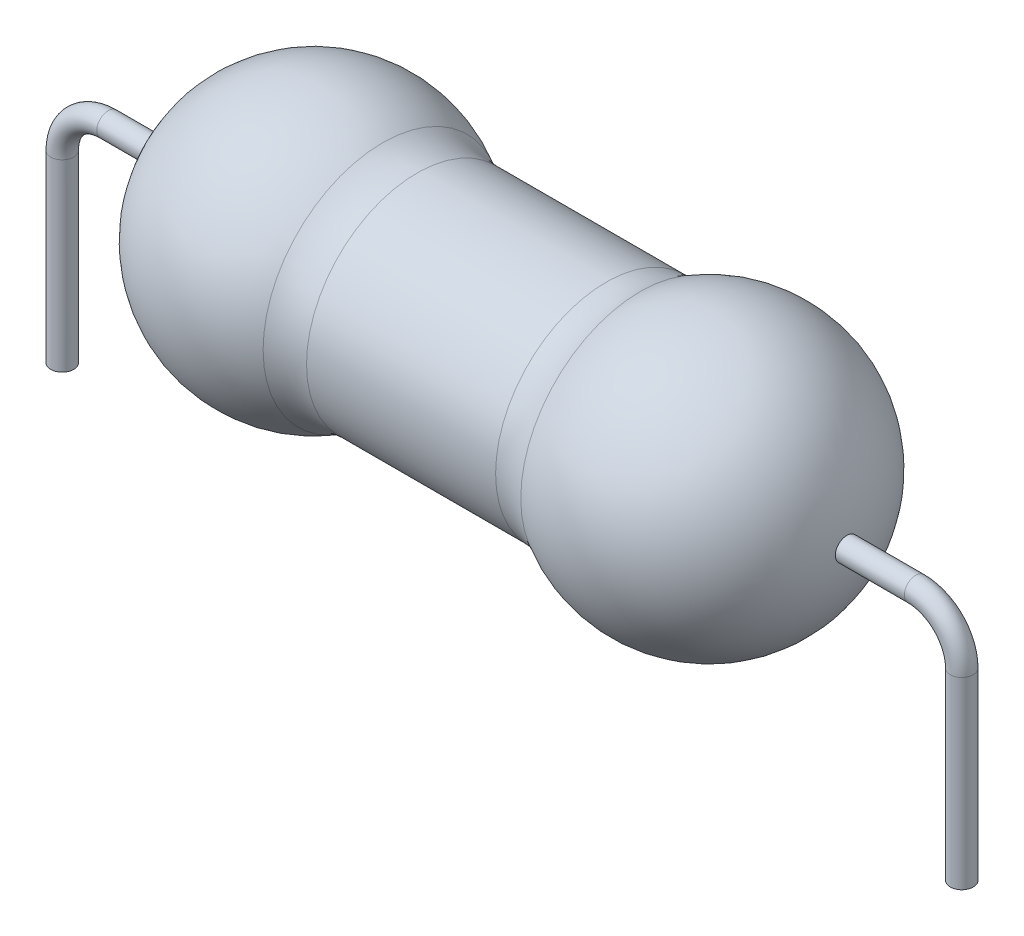
ISO-10303-21;
HEADER;
FILE_DESCRIPTION(('STEP AP214'),'2;1');
FILE_NAME('part.step','',(''),(''),'','','');
FILE_SCHEMA(('AUTOMOTIVE_DESIGN { 1 0 10303 214 1 1 1 1 }'));
ENDSEC;
DATA;
#1=APPLICATION_CONTEXT('core data for automotive mechanical design processes');
#2=APPLICATION_PROTOCOL_DEFINITION('international standard','automotive_design',2000,#1);
#3=PRODUCT_CONTEXT('',#1,'mechanical');
#4=PRODUCT('Part','Part','',(#3));
#5=PRODUCT_RELATED_PRODUCT_CATEGORY('part','',(#4));
#6=PRODUCT_DEFINITION_FORMATION('','',#4);
#7=PRODUCT_DEFINITION_CONTEXT('part definition',#1,'design');
#8=PRODUCT_DEFINITION('design','',#6,#7);
#9=PRODUCT_DEFINITION_SHAPE('','',#8);
#10=(LENGTH_UNIT() NAMED_UNIT(*) SI_UNIT(.MILLI.,.METRE.));
#11=(NAMED_UNIT(*) PLANE_ANGLE_UNIT() SI_UNIT($,.RADIAN.));
#12=(NAMED_UNIT(*) SI_UNIT($,.STERADIAN.) SOLID_ANGLE_UNIT());
#13=UNCERTAINTY_MEASURE_WITH_UNIT(LENGTH_MEASURE(1.E-05),#10,'distance_accuracy_value','');
#14=(GEOMETRIC_REPRESENTATION_CONTEXT(3) GLOBAL_UNCERTAINTY_ASSIGNED_CONTEXT((#13)) GLOBAL_UNIT_ASSIGNED_CONTEXT((#10,
#11,#12)) REPRESENTATION_CONTEXT('',''));
#15=CARTESIAN_POINT('',(0.,0.,0.));
#16=DIRECTION('',(0.,0.,1.));
#17=DIRECTION('',(1.,0.,0.));
#18=AXIS2_PLACEMENT_3D('',#15,#16,#17);
#19=CARTESIAN_POINT('',(-28.4155541984913,-0.103436393324968,-0.041734320389781));
#20=DIRECTION('',(-1.,0.,0.));
#21=DIRECTION('',(0.,0.,-1.));
#22=AXIS2_PLACEMENT_3D('',#19,#20,#21);
#23=PLANE('',#22);
#24=CARTESIAN_POINT('',(-28.4155541984913,-0.103436393324968,-0.041734320389781));
#25=DIRECTION('',(-1.,0.,0.));
#26=DIRECTION('',(0.,0.,-1.));
#27=AXIS2_PLACEMENT_3D('',#24,#25,#26);
#28=CIRCLE('',#27,0.499999999999999);
#29=CARTESIAN_POINT('',(-28.4155541984913,-0.103436393324968,-0.54173432038978));
#30=VERTEX_POINT('',#29);
#31=EDGE_CURVE('E59',#30,#30,#28,.T.);
#32=ORIENTED_EDGE('',*,*,#31,.F.);
#33=EDGE_LOOP('',(#32));
#34=FACE_BOUND('',#33,.T.);
#35=ADVANCED_FACE('F45',(#34),#23,.F.);
#36=CARTESIAN_POINT('',(-33.4155541984913,-10.103436393325,-0.0417343203897822));
#37=DIRECTION('',(0.,-1.,0.));
#38=DIRECTION('',(0.,0.,-1.));
#39=AXIS2_PLACEMENT_3D('',#36,#37,#38);
#40=PLANE('',#39);
#41=CARTESIAN_POINT('',(-33.4155541984913,-10.103436393325,-0.0417343203897822));
#42=DIRECTION('',(0.,-1.,0.));
#43=DIRECTION('',(0.,0.,-1.));
#44=AXIS2_PLACEMENT_3D('',#41,#42,#43);
#45=CIRCLE('',#44,0.499999999999999);
#46=CARTESIAN_POINT('',(-33.4155541984913,-10.103436393325,-0.541734320389781));
#47=VERTEX_POINT('',#46);
#48=EDGE_CURVE('E11',#47,#47,#45,.T.);
#49=ORIENTED_EDGE('',*,*,#48,.T.);
#50=EDGE_LOOP('',(#49));
#51=FACE_BOUND('',#50,.T.);
#52=ADVANCED_FACE('F68',(#51),#40,.T.);
#53=CARTESIAN_POINT('',(-28.4155541984913,-0.103436393324968,-0.041734320389781));
#54=DIRECTION('',(-1.,0.,0.));
#55=DIRECTION('',(0.,0.,1.));
#56=AXIS2_PLACEMENT_3D('',#53,#54,#55);
#57=CYLINDRICAL_SURFACE('',#56,0.499999999999999);
#58=CARTESIAN_POINT('',(-31.4155541984913,-0.103436393324968,-0.041734320389781));
#59=DIRECTION('',(-1.,0.,0.));
#60=DIRECTION('',(0.,0.,-1.));
#61=AXIS2_PLACEMENT_3D('',#58,#59,#60);
#62=CIRCLE('',#61,0.499999999999999);
#63=CARTESIAN_POINT('',(-31.4155541984913,0.396563606675031,-0.0417343203897809));
#64=VERTEX_POINT('',#63);
#65=EDGE_CURVE('E55',#64,#64,#62,.T.);
#66=ORIENTED_EDGE('',*,*,#65,.F.);
#67=EDGE_LOOP('',(#66));
#68=FACE_BOUND('',#67,.T.);
#69=ORIENTED_EDGE('',*,*,#31,.T.);
#70=EDGE_LOOP('',(#69));
#71=FACE_BOUND('',#70,.T.);
#72=ADVANCED_FACE('F65',(#68,#71),#57,.T.);
#73=CARTESIAN_POINT('',(-31.4155541984913,-2.10343639332497,-0.0417343203897812));
#74=DIRECTION('',(0.,0.,1.));
#75=DIRECTION('',(0.,-1.,0.));
#76=AXIS2_PLACEMENT_3D('',#73,#74,#75);
#77=TOROIDAL_SURFACE('',#76,2.,0.499999999999999);
#78=CARTESIAN_POINT('',(-33.4155541984913,-2.10343639332497,-0.0417343203897802));
#79=DIRECTION('',(0.,-1.,0.));
#80=DIRECTION('',(0.,0.,-1.));
#81=AXIS2_PLACEMENT_3D('',#78,#79,#80);
#82=CIRCLE('',#81,0.499999999999999);
#83=CARTESIAN_POINT('',(-33.9155541984913,-2.10343639332497,-0.04173432038978));
#84=VERTEX_POINT('',#83);
#85=EDGE_CURVE('E51',#84,#84,#82,.T.);
#86=CARTESIAN_POINT('',(-31.4155541984913,-2.10343639332497,-0.0417343203897812));
#87=DIRECTION('',(0.,0.,1.));
#88=DIRECTION('',(0.,-1.,0.));
#89=AXIS2_PLACEMENT_3D('',#86,#87,#88);
#90=CIRCLE('',#89,2.5);
#91=EDGE_CURVE('',#64,#84,#90,.T.);
#92=ORIENTED_EDGE('',*,*,#65,.T.);
#93=ORIENTED_EDGE('',*,*,#85,.F.);
#94=ORIENTED_EDGE('',*,*,#91,.T.);
#95=ORIENTED_EDGE('',*,*,#91,.F.);
#96=EDGE_LOOP('',(#92,#94,#93,#95));
#97=FACE_BOUND('',#96,.T.);
#98=ADVANCED_FACE('F74',(#97),#77,.T.);
#99=CARTESIAN_POINT('',(-33.4155541984913,-2.10343639332497,-0.0417343203897812));
#100=DIRECTION('',(0.,-1.,0.));
#101=DIRECTION('',(0.,0.,-1.));
#102=AXIS2_PLACEMENT_3D('',#99,#100,#101);
#103=CYLINDRICAL_SURFACE('',#102,0.499999999999999);
#104=ORIENTED_EDGE('',*,*,#48,.F.);
#105=EDGE_LOOP('',(#104));
#106=FACE_BOUND('',#105,.T.);
#107=ORIENTED_EDGE('',*,*,#85,.T.);
#108=EDGE_LOOP('',(#107));
#109=FACE_BOUND('',#108,.T.);
#110=ADVANCED_FACE('F72',(#106,#109),#103,.T.);
#111=CLOSED_SHELL('',(#35,#52,#72,#98,#110));
#112=MANIFOLD_SOLID_BREP('B2',#111);
#113=CARTESIAN_POINT('',(-5.23568370394465,0.,0.));
#114=DIRECTION('',(-1.,0.,0.));
#115=DIRECTION('',(0.,1.,0.));
#116=AXIS2_PLACEMENT_3D('',#113,#114,#115);
#117=SPHERICAL_SURFACE('',#116,6.);
#118=CARTESIAN_POINT('',(-8.2193461310514,0.,0.));
#119=DIRECTION('',(-1.,0.,0.));
#120=DIRECTION('',(0.,0.,1.));
#121=AXIS2_PLACEMENT_3D('',#118,#119,#120);
#122=CIRCLE('',#121,5.205550741379);
#123=CARTESIAN_POINT('',(-8.2193461310514,5.205550741379,0.));
#124=VERTEX_POINT('',#123);
#125=EDGE_CURVE('E134',#124,#124,#122,.T.);
#126=CARTESIAN_POINT('',(0.763145634724793,0.,0.));
#127=DIRECTION('',(1.,0.,0.));
#128=DIRECTION('',(0.,1.,0.));
#129=AXIS2_PLACEMENT_3D('',#126,#127,#128);
#130=CIRCLE('',#129,0.118518207541055);
#131=CARTESIAN_POINT('',(0.763145634724793,0.118518207541072,0.));
#132=VERTEX_POINT('',#131);
#133=EDGE_CURVE('E44',#132,#132,#130,.T.);
#134=CARTESIAN_POINT('',(-8.2193461310514,5.205550741379,0.));
#135=CARTESIAN_POINT('',(-8.10702292223246,5.26993822179761,0.));
#136=CARTESIAN_POINT('',(-7.99261032030898,5.33067894872886,0.));
#137=CARTESIAN_POINT('',(-7.7600977953415,5.44463730317506,0.));
#138=CARTESIAN_POINT('',(-7.6419978722975,5.49785493069002,0.));
#139=CARTESIAN_POINT('',(-7.40260217017761,5.59653749386209,0.));
#140=CARTESIAN_POINT('',(-7.28130639110171,5.6420024295192,0.));
#141=CARTESIAN_POINT('',(-7.03602796855051,5.72499093750391,0.));
#142=CARTESIAN_POINT('',(-6.91204532507521,5.76251450983152,0.));
#143=CARTESIAN_POINT('',(-6.66191231182537,5.82946262398149,0.));
#144=CARTESIAN_POINT('',(-6.53576194205083,5.85888716580386,0.));
#145=CARTESIAN_POINT('',(-6.28182199222567,5.90951408548375,0.));
#146=CARTESIAN_POINT('',(-6.15403241217506,5.93071646334127,0.));
#147=CARTESIAN_POINT('',(-5.89734934497091,5.96481020243284,0.));
#148=CARTESIAN_POINT('',(-5.76845585781738,5.97770156366689,0.));
#149=CARTESIAN_POINT('',(-5.51010492526398,5.99511927584483,0.));
#150=CARTESIAN_POINT('',(-5.38064747986411,5.99964562678873,0.));
#151=CARTESIAN_POINT('',(-5.12171093642072,6.00031435470282,0.));
#152=CARTESIAN_POINT('',(-4.9922318383772,5.996456731673,0.));
#153=CARTESIAN_POINT('',(-4.73379438748549,5.98037367216821,0.));
#154=CARTESIAN_POINT('',(-4.6048360346373,5.96814823569322,0.));
#155=CARTESIAN_POINT('',(-4.34798029012469,5.93538076237844,0.));
#156=CARTESIAN_POINT('',(-4.22008289846026,5.91483872553865,0.));
#157=CARTESIAN_POINT('',(-3.96588484796873,5.86552410365287,0.));
#158=CARTESIAN_POINT('',(-3.83958418914163,5.83675151860687,0.));
#159=CARTESIAN_POINT('',(-3.58910868711691,5.77109633078216,0.));
#160=CARTESIAN_POINT('',(-3.4649338439193,5.73421372800344,0.));
#161=CARTESIAN_POINT('',(-3.21923015075477,5.65249300866678,0.));
#162=CARTESIAN_POINT('',(-3.09770130078786,5.60765489210885,0.));
#163=CARTESIAN_POINT('',(-2.85779868742256,5.51021097539841,0.));
#164=CARTESIAN_POINT('',(-2.73942492402418,5.45760517524591,0.));
#165=CARTESIAN_POINT('',(-2.50632836024337,5.34484626093305,0.));
#166=CARTESIAN_POINT('',(-2.39160555986096,5.2846931467727,0.));
#167=CARTESIAN_POINT('',(-2.1662915044054,5.15709159028696,0.));
#168=CARTESIAN_POINT('',(-2.05570024933226,5.08964314796158,0.));
#169=CARTESIAN_POINT('',(-1.83911255943974,4.94773348165779,0.));
#170=CARTESIAN_POINT('',(-1.73311612462034,4.87327225767939,0.));
#171=CARTESIAN_POINT('',(-1.52616210213833,4.7176489516424,0.));
#172=CARTESIAN_POINT('',(-1.42520451447571,4.63648686958381,0.));
#173=CARTESIAN_POINT('',(-1.22875110510566,4.46780184134931,0.));
#174=CARTESIAN_POINT('',(-1.13325528339824,4.38027889517341,0.));
#175=CARTESIAN_POINT('',(-0.948125445000388,4.1992387787969,0.));
#176=CARTESIAN_POINT('',(-0.858491428309962,4.10572160859629,0.));
#177=CARTESIAN_POINT('',(-0.685460683455393,3.91308479451211,0.));
#178=CARTESIAN_POINT('',(-0.602063955291252,3.81396515062853,0.));
#179=CARTESIAN_POINT('',(-0.441857142602438,3.61053860869102,0.));
#180=CARTESIAN_POINT('',(-0.365047058077766,3.50623171063709,0.));
#181=CARTESIAN_POINT('',(-0.218335295594871,3.2928676096838,0.));
#182=CARTESIAN_POINT('',(-0.148433617636649,3.18381040678446,0.));
#183=CARTESIAN_POINT('',(-0.0158314923169724,2.96140254476483,0.));
#184=CARTESIAN_POINT('',(0.0468689550444815,2.84805188564455,0.));
#185=CARTESIAN_POINT('',(0.16480596509574,2.61753194570683,0.));
#186=CARTESIAN_POINT('',(0.220042527785544,2.50036266488937,0.));
#187=CARTESIAN_POINT('',(0.322820368240568,2.26269631147355,0.));
#188=CARTESIAN_POINT('',(0.370361646005788,2.14219923887519,0.));
#189=CARTESIAN_POINT('',(0.457549800779495,1.89838207627043,0.));
#190=CARTESIAN_POINT('',(0.497196677787984,1.77506198626405,0.));
#191=CARTESIAN_POINT('',(0.568429805174355,1.52611537377768,0.));
#192=CARTESIAN_POINT('',(0.600016055552238,1.40048885129769,0.));
#193=CARTESIAN_POINT('',(0.654996143142026,1.14745567759244,0.));
#194=CARTESIAN_POINT('',(0.67838998035393,1.02004902636717,0.));
#195=CARTESIAN_POINT('',(0.7168852628609,0.763989143346816,0.));
#196=CARTESIAN_POINT('',(0.731986708155965,0.635335911551738,0.));
#197=CARTESIAN_POINT('',(0.753841336103632,0.377322431182768,0.));
#198=CARTESIAN_POINT('',(0.760594518756235,0.247962182608876,0.));
#199=CARTESIAN_POINT('',(0.763145634724793,0.118518207541072,0.));
#200=B_SPLINE_CURVE_WITH_KNOTS('',3,(#134,#135,#136,#137,#138,#139,#140,#141,#142,#143,#144,
#145,#146,#147,#148,#149,#150,#151,#152,#153,#154,#155,#156,#157,#158,#159,#160,#161,#162,#163,
#164,#165,#166,#167,#168,#169,#170,#171,#172,#173,#174,#175,#176,#177,#178,#179,#180,#181,#182,
#183,#184,#185,#186,#187,#188,#189,#190,#191,#192,#193,#194,#195,#196,#197,#198,#199),
.UNSPECIFIED.,.F.,.F.,(4,2,2,2,2,2,2,2,2,2,2,2,2,2,2,2,2,2,2,2,2,2,2,2,2,2,2,2,2,2,2,2,4),(0.,
0.388338334203547,0.776676668407091,1.16501500261064,1.55335333681418,1.94169167101773,
2.33003000522127,2.71836833942482,3.10670667362837,3.49504500783191,3.88338334203546,
4.271721676239,4.66006001044255,5.04839834464609,5.43673667884964,5.82507501305318,
6.21341334725673,6.60175168146028,6.99009001566382,7.37842834986737,7.76676668407091,
8.15510501827446,8.543443352478,8.93178168668155,9.3201200208851,9.70845835508864,
10.0967966892922,10.4851350234957,10.8734733576993,11.2618116919028,11.6501500261064,
12.0384883603099,12.4268266945135),.UNSPECIFIED.);
#201=EDGE_CURVE('BSEAM116',#124,#132,#200,.T.);
#202=ORIENTED_EDGE('',*,*,#125,.F.);
#203=ORIENTED_EDGE('',*,*,#133,.F.);
#204=ORIENTED_EDGE('',*,*,#201,.T.);
#205=ORIENTED_EDGE('',*,*,#201,.F.);
#206=EDGE_LOOP('',(#202,#204,#203,#205));
#207=FACE_BOUND('',#206,.T.);
#208=ADVANCED_FACE('F116',(#207),#117,.T.);
#209=CARTESIAN_POINT('',(-17.9379334412551,0.,0.));
#210=DIRECTION('',(-1.,0.,0.));
#211=DIRECTION('',(0.,0.,1.));
#212=AXIS2_PLACEMENT_3D('',#209,#210,#211);
#213=TOROIDAL_SURFACE('',#212,7.8083261120685,3.);
#214=CARTESIAN_POINT('',(-19.4297646548085,0.,0.));
#215=DIRECTION('',(-1.,0.,0.));
#216=DIRECTION('',(0.,0.,1.));
#217=AXIS2_PLACEMENT_3D('',#214,#215,#216);
#218=CIRCLE('',#217,5.205550741379);
#219=CARTESIAN_POINT('',(-19.4297646548085,0.,5.205550741379));
#220=VERTEX_POINT('',#219);
#221=EDGE_CURVE('E140',#220,#220,#218,.T.);
#222=ORIENTED_EDGE('',*,*,#221,.F.);
#223=EDGE_LOOP('',(#222));
#224=FACE_BOUND('',#223,.T.);
#225=CARTESIAN_POINT('',(-17.9379334412551,0.,0.));
#226=DIRECTION('',(-1.,0.,0.));
#227=DIRECTION('',(0.,0.,1.));
#228=AXIS2_PLACEMENT_3D('',#225,#226,#227);
#229=CIRCLE('',#228,4.8083261120685);
#230=CARTESIAN_POINT('',(-17.9379334412551,0.,4.8083261120685));
#231=VERTEX_POINT('',#230);
#232=EDGE_CURVE('E124',#231,#231,#229,.T.);
#233=ORIENTED_EDGE('',*,*,#232,.T.);
#234=EDGE_LOOP('',(#233));
#235=FACE_BOUND('',#234,.T.);
#236=ADVANCED_FACE('F118',(#224,#235),#213,.F.);
#237=CARTESIAN_POINT('',(-28.4134270819153,0.,0.));
#238=DIRECTION('',(-1.,0.,0.));
#239=DIRECTION('',(0.,0.,1.));
#240=AXIS2_PLACEMENT_3D('',#237,#238,#239);
#241=CYLINDRICAL_SURFACE('',#240,4.8083261120685);
#242=ORIENTED_EDGE('',*,*,#232,.F.);
#243=EDGE_LOOP('',(#242));
#244=FACE_BOUND('',#243,.T.);
#245=CARTESIAN_POINT('',(-9.71117734460478,0.,0.));
#246=DIRECTION('',(-1.,0.,0.));
#247=DIRECTION('',(0.,0.,1.));
#248=AXIS2_PLACEMENT_3D('',#245,#246,#247);
#249=CIRCLE('',#248,4.8083261120685);
#250=CARTESIAN_POINT('',(-9.71117734460478,0.,4.8083261120685));
#251=VERTEX_POINT('',#250);
#252=EDGE_CURVE('E129',#251,#251,#249,.T.);
#253=ORIENTED_EDGE('',*,*,#252,.T.);
#254=EDGE_LOOP('',(#253));
#255=FACE_BOUND('',#254,.T.);
#256=ADVANCED_FACE('F184',(#244,#255),#241,.T.);
#257=CARTESIAN_POINT('',(-9.71117734460477,0.,0.));
#258=DIRECTION('',(-1.,0.,0.));
#259=DIRECTION('',(0.,0.,1.));
#260=AXIS2_PLACEMENT_3D('',#257,#258,#259);
#261=TOROIDAL_SURFACE('',#260,7.8083261120685,3.);
#262=ORIENTED_EDGE('',*,*,#252,.F.);
#263=EDGE_LOOP('',(#262));
#264=FACE_BOUND('',#263,.T.);
#265=ORIENTED_EDGE('',*,*,#125,.T.);
#266=EDGE_LOOP('',(#265));
#267=FACE_BOUND('',#266,.T.);
#268=ADVANCED_FACE('F174',(#264,#267),#261,.F.);
#269=CARTESIAN_POINT('',(-22.4134270819153,0.,0.));
#270=DIRECTION('',(-1.,0.,0.));
#271=DIRECTION('',(0.,1.,0.));
#272=AXIS2_PLACEMENT_3D('',#269,#270,#271);
#273=SPHERICAL_SURFACE('',#272,6.);
#274=ORIENTED_EDGE('',*,*,#221,.T.);
#275=EDGE_LOOP('',(#274));
#276=FACE_BOUND('',#275,.T.);
#277=ADVANCED_FACE('F166',(#276),#273,.T.);
#278=CARTESIAN_POINT('',(0.763145634724793,0.002815014454427,0.));
#279=DIRECTION('',(1.,0.,0.));
#280=DIRECTION('',(0.,1.,0.));
#281=AXIS2_PLACEMENT_3D('',#278,#279,#280);
#282=PLANE('',#281);
#283=ORIENTED_EDGE('',*,*,#133,.T.);
#284=EDGE_LOOP('',(#283));
#285=FACE_BOUND('',#284,.T.);
#286=CARTESIAN_POINT('',(0.763145634724793,0.002815014454427,0.));
#287=DIRECTION('',(1.,0.,0.));
#288=DIRECTION('',(0.,1.,0.));
#289=AXIS2_PLACEMENT_3D('',#286,#287,#288);
#290=CIRCLE('',#289,0.5);
#291=CARTESIAN_POINT('',(0.763145634724793,0.502815014454427,0.));
#292=VERTEX_POINT('',#291);
#293=EDGE_CURVE('E156',#292,#292,#290,.T.);
#294=ORIENTED_EDGE('',*,*,#293,.F.);
#295=EDGE_LOOP('',(#294));
#296=FACE_BOUND('',#295,.T.);
#297=ADVANCED_FACE('F163',(#285,#296),#282,.F.);
#298=CARTESIAN_POINT('',(5.76314563472479,-9.99718498554557,0.));
#299=DIRECTION('',(0.,-1.,0.));
#300=DIRECTION('',(1.,0.,0.));
#301=AXIS2_PLACEMENT_3D('',#298,#299,#300);
#302=PLANE('',#301);
#303=CARTESIAN_POINT('',(5.76314563472479,-9.99718498554557,0.));
#304=DIRECTION('',(0.,-1.,0.));
#305=DIRECTION('',(1.,0.,0.));
#306=AXIS2_PLACEMENT_3D('',#303,#304,#305);
#307=CIRCLE('',#306,0.5);
#308=CARTESIAN_POINT('',(6.26314563472479,-9.99718498554557,0.));
#309=VERTEX_POINT('',#308);
#310=EDGE_CURVE('E144',#309,#309,#307,.T.);
#311=ORIENTED_EDGE('',*,*,#310,.T.);
#312=EDGE_LOOP('',(#311));
#313=FACE_BOUND('',#312,.T.);
#314=ADVANCED_FACE('F165',(#313),#302,.T.);
#315=CARTESIAN_POINT('',(0.763145634724793,0.002815014454427,0.));
#316=DIRECTION('',(1.,0.,0.));
#317=DIRECTION('',(0.,0.,-1.));
#318=AXIS2_PLACEMENT_3D('',#315,#316,#317);
#319=CYLINDRICAL_SURFACE('',#318,0.5);
#320=CARTESIAN_POINT('',(3.76314563472479,0.002815014454427,0.));
#321=DIRECTION('',(1.,0.,0.));
#322=DIRECTION('',(0.,1.,0.));
#323=AXIS2_PLACEMENT_3D('',#320,#321,#322);
#324=CIRCLE('',#323,0.5);
#325=CARTESIAN_POINT('',(3.76314563472479,0.502815014454427,0.));
#326=VERTEX_POINT('',#325);
#327=EDGE_CURVE('E152',#326,#326,#324,.T.);
#328=ORIENTED_EDGE('',*,*,#327,.F.);
#329=EDGE_LOOP('',(#328));
#330=FACE_BOUND('',#329,.T.);
#331=ORIENTED_EDGE('',*,*,#293,.T.);
#332=EDGE_LOOP('',(#331));
#333=FACE_BOUND('',#332,.T.);
#334=ADVANCED_FACE('F161',(#330,#333),#319,.T.);
#335=CARTESIAN_POINT('',(3.76314563472479,-1.99718498554557,0.));
#336=DIRECTION('',(0.,0.,-1.));
#337=DIRECTION('',(-1.,0.,0.));
#338=AXIS2_PLACEMENT_3D('',#335,#336,#337);
#339=TOROIDAL_SURFACE('',#338,2.,0.5);
#340=CARTESIAN_POINT('',(5.76314563472479,-1.99718498554557,0.));
#341=DIRECTION('',(0.,-1.,0.));
#342=DIRECTION('',(1.,0.,0.));
#343=AXIS2_PLACEMENT_3D('',#340,#341,#342);
#344=CIRCLE('',#343,0.5);
#345=CARTESIAN_POINT('',(6.2631456347248,-1.99718498554558,0.));
#346=VERTEX_POINT('',#345);
#347=EDGE_CURVE('E148',#346,#346,#344,.T.);
#348=CARTESIAN_POINT('',(3.76314563472479,-1.99718498554557,0.));
#349=DIRECTION('',(0.,0.,-1.));
#350=DIRECTION('',(-1.,0.,0.));
#351=AXIS2_PLACEMENT_3D('',#348,#349,#350);
#352=CIRCLE('',#351,2.5);
#353=EDGE_CURVE('',#326,#346,#352,.T.);
#354=ORIENTED_EDGE('',*,*,#327,.T.);
#355=ORIENTED_EDGE('',*,*,#347,.F.);
#356=ORIENTED_EDGE('',*,*,#353,.T.);
#357=ORIENTED_EDGE('',*,*,#353,.F.);
#358=EDGE_LOOP('',(#354,#356,#355,#357));
#359=FACE_BOUND('',#358,.T.);
#360=ADVANCED_FACE('F231',(#359),#339,.T.);
#361=CARTESIAN_POINT('',(5.76314563472479,-1.99718498554557,0.));
#362=DIRECTION('',(0.,-1.,0.));
#363=DIRECTION('',(1.,0.,0.));
#364=AXIS2_PLACEMENT_3D('',#361,#362,#363);
#365=CYLINDRICAL_SURFACE('',#364,0.5);
#366=ORIENTED_EDGE('',*,*,#310,.F.);
#367=EDGE_LOOP('',(#366));
#368=FACE_BOUND('',#367,.T.);
#369=ORIENTED_EDGE('',*,*,#347,.T.);
#370=EDGE_LOOP('',(#369));
#371=FACE_BOUND('',#370,.T.);
#372=ADVANCED_FACE('F177',(#368,#371),#365,.T.);
#373=CLOSED_SHELL('',(#208,#236,#256,#268,#277,#297,#314,#334,#360,#372));
#374=MANIFOLD_SOLID_BREP('B6',#373);
#375=ADVANCED_BREP_SHAPE_REPRESENTATION('',(#18,#112,#374),#14);
#376=SHAPE_DEFINITION_REPRESENTATION(#9,#375);
ENDSEC;
END-ISO-10303-21;
